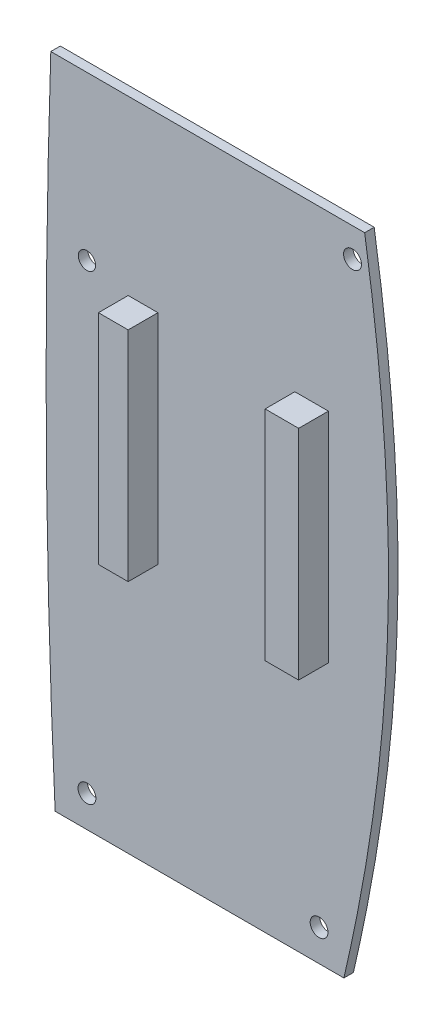
ISO-10303-21;
HEADER;
FILE_DESCRIPTION(('STEP AP214'),'2;1');
FILE_NAME('part.step','',(''),(''),'','','');
FILE_SCHEMA(('AUTOMOTIVE_DESIGN { 1 0 10303 214 1 1 1 1 }'));
ENDSEC;
DATA;
#1=APPLICATION_CONTEXT('core data for automotive mechanical design processes');
#2=APPLICATION_PROTOCOL_DEFINITION('international standard','automotive_design',2000,#1);
#3=PRODUCT_CONTEXT('',#1,'mechanical');
#4=PRODUCT('Part','Part','',(#3));
#5=PRODUCT_RELATED_PRODUCT_CATEGORY('part','',(#4));
#6=PRODUCT_DEFINITION_FORMATION('','',#4);
#7=PRODUCT_DEFINITION_CONTEXT('part definition',#1,'design');
#8=PRODUCT_DEFINITION('design','',#6,#7);
#9=PRODUCT_DEFINITION_SHAPE('','',#8);
#10=(LENGTH_UNIT() NAMED_UNIT(*) SI_UNIT(.MILLI.,.METRE.));
#11=(NAMED_UNIT(*) PLANE_ANGLE_UNIT() SI_UNIT($,.RADIAN.));
#12=(NAMED_UNIT(*) SI_UNIT($,.STERADIAN.) SOLID_ANGLE_UNIT());
#13=UNCERTAINTY_MEASURE_WITH_UNIT(LENGTH_MEASURE(1.E-05),#10,'distance_accuracy_value','');
#14=(GEOMETRIC_REPRESENTATION_CONTEXT(3) GLOBAL_UNCERTAINTY_ASSIGNED_CONTEXT((#13)) GLOBAL_UNIT_ASSIGNED_CONTEXT((#10,
#11,#12)) REPRESENTATION_CONTEXT('',''));
#15=CARTESIAN_POINT('',(0.,0.,0.));
#16=DIRECTION('',(0.,0.,1.));
#17=DIRECTION('',(1.,0.,0.));
#18=AXIS2_PLACEMENT_3D('',#15,#16,#17);
#19=CARTESIAN_POINT('',(7.89567877421469,5.17088600865722,57.));
#20=DIRECTION('',(0.,0.,1.));
#21=DIRECTION('',(1.,0.,0.));
#22=AXIS2_PLACEMENT_3D('',#19,#20,#21);
#23=PLANE('',#22);
#24=DIRECTION('',(0.,-1.,0.));
#25=VECTOR('',#24,1.);
#26=CARTESIAN_POINT('',(-7.72058582335578,31.4771190883367,56.9999999999954));
#27=LINE('',#26,#25);
#28=CARTESIAN_POINT('',(-7.72058582335578,31.4771190883367,56.9999999999954));
#29=VERTEX_POINT('',#28);
#30=CARTESIAN_POINT('',(-7.72058582335581,-5.15543731932285,56.9999999999954));
#31=VERTEX_POINT('',#30);
#32=EDGE_CURVE('E43',#29,#31,#27,.T.);
#33=ORIENTED_EDGE('',*,*,#32,.F.);
#34=DIRECTION('',(-1.,0.,0.));
#35=VECTOR('',#34,1.);
#36=CARTESIAN_POINT('',(-2.08219787617224,31.4771190883367,56.9999999999954));
#37=LINE('',#36,#35);
#38=CARTESIAN_POINT('',(-2.08219787617224,31.4771190883367,56.9999999999954));
#39=VERTEX_POINT('',#38);
#40=EDGE_CURVE('E171',#39,#29,#37,.T.);
#41=ORIENTED_EDGE('',*,*,#40,.F.);
#42=DIRECTION('',(0.,1.,0.));
#43=VECTOR('',#42,1.);
#44=CARTESIAN_POINT('',(-2.08219787617224,-5.15543731932285,56.9999999999954));
#45=LINE('',#44,#43);
#46=CARTESIAN_POINT('',(-2.08219787617224,-5.15543731932285,56.9999999999954));
#47=VERTEX_POINT('',#46);
#48=EDGE_CURVE('E167',#47,#39,#45,.T.);
#49=ORIENTED_EDGE('',*,*,#48,.F.);
#50=DIRECTION('',(1.,0.,0.));
#51=VECTOR('',#50,1.);
#52=CARTESIAN_POINT('',(-7.72058582335581,-5.15543731932285,56.9999999999954));
#53=LINE('',#52,#51);
#54=EDGE_CURVE('E163',#31,#47,#53,.T.);
#55=ORIENTED_EDGE('',*,*,#54,.F.);
#56=EDGE_LOOP('',(#33,#41,#49,#55));
#57=FACE_BOUND('',#56,.T.);
#58=CARTESIAN_POINT('',(4.00739224627871,60.477119088337,57.));
#59=CARTESIAN_POINT('',(5.43333073359915,51.3264832024376,57.));
#60=CARTESIAN_POINT('',(6.54900391871018,42.1415584414736,57.));
#61=CARTESIAN_POINT('',(7.40461832441734,30.600837603447,57.));
#62=CARTESIAN_POINT('',(7.54885707462838,28.2887196910434,57.));
#63=CARTESIAN_POINT('',(7.77976152528264,23.6651953164178,57.));
#64=CARTESIAN_POINT('',(7.86647537246692,21.3534255928287,57.));
#65=CARTESIAN_POINT('',(8.03658111829138,14.4180928113124,57.));
#66=CARTESIAN_POINT('',(8.0295827762736,9.79450604968723,57.));
#67=CARTESIAN_POINT('',(7.82872677318524,2.85907598814219,57.));
#68=CARTESIAN_POINT('',(7.73013289476406,0.547257669944885,57.));
#69=CARTESIAN_POINT('',(7.46913832012751,-4.07639569898101,57.));
#70=CARTESIAN_POINT('',(7.30678534194772,-6.38666143579652,57.));
#71=CARTESIAN_POINT('',(6.72643187845647,-13.299429900123,57.));
#72=CARTESIAN_POINT('',(6.21455108238158,-17.8891513423791,57.));
#73=CARTESIAN_POINT('',(4.95740874845812,-27.033504775496,57.));
#74=CARTESIAN_POINT('',(4.21227637536106,-31.5881561866408,57.));
#75=CARTESIAN_POINT('',(2.51364077693253,-40.66612986482,57.));
#76=CARTESIAN_POINT('',(1.56026994852288,-45.1894720381041,57.));
#77=CARTESIAN_POINT('',(0.517305485340313,-49.6993435562314,57.));
#78=B_SPLINE_CURVE_WITH_KNOTS('',3,(#58,#59,#60,#61,#62,#63,#64,#65,#66,#67,#68,#69,#70,#71,#72,
#73,#74,#75,#76,#77),.UNSPECIFIED.,.F.,.F.,(4,2,2,2,2,2,2,2,2,4),(0.,0.25,0.3125,0.375,0.5,
0.5625,0.625,0.75,0.875,1.),.UNSPECIFIED.);
#79=CARTESIAN_POINT('',(4.00739224627871,60.477119088337,57.));
#80=VERTEX_POINT('',#79);
#81=CARTESIAN_POINT('',(0.517305485340313,-49.6993435562314,57.));
#82=VERTEX_POINT('',#81);
#83=EDGE_CURVE('E205',#80,#82,#78,.T.);
#84=ORIENTED_EDGE('',*,*,#83,.F.);
#85=DIRECTION('',(1.,0.,0.));
#86=VECTOR('',#85,1.);
#87=CARTESIAN_POINT('',(-48.7225396291997,60.4771190883368,57.));
#88=LINE('',#87,#86);
#89=CARTESIAN_POINT('',(-48.7225396291997,60.4771190883368,57.));
#90=VERTEX_POINT('',#89);
#91=EDGE_CURVE('E227',#90,#80,#88,.T.);
#92=ORIENTED_EDGE('',*,*,#91,.F.);
#93=CARTESIAN_POINT('',(-47.992876177723,-49.6993435562314,57.));
#94=CARTESIAN_POINT('',(-48.4312043906747,-40.5250224919465,57.));
#95=CARTESIAN_POINT('',(-48.7792687225727,-31.3473730506425,57.));
#96=CARTESIAN_POINT('',(-49.2798548054885,-12.9848637597862,57.));
#97=CARTESIAN_POINT('',(-49.4321794219055,-3.80159394272926,57.));
#98=CARTESIAN_POINT('',(-49.5415642027007,14.567135328284,57.));
#99=CARTESIAN_POINT('',(-49.4986713370206,23.7515176759512,57.));
#100=CARTESIAN_POINT('',(-49.2356415747046,42.1162375276829,57.));
#101=CARTESIAN_POINT('',(-49.0157447637978,51.2972409029398,57.));
#102=CARTESIAN_POINT('',(-48.7225396291997,60.4771190883368,57.));
#103=B_SPLINE_CURVE_WITH_KNOTS('',3,(#93,#94,#95,#96,#97,#98,#99,#100,#101,#102),.UNSPECIFIED.,
.F.,.F.,(4,2,2,2,4),(0.,0.25,0.5,0.75,1.),.UNSPECIFIED.);
#104=CARTESIAN_POINT('',(-47.992876177723,-49.6993435562314,57.));
#105=VERTEX_POINT('',#104);
#106=EDGE_CURVE('E220',#105,#90,#103,.T.);
#107=ORIENTED_EDGE('',*,*,#106,.F.);
#108=DIRECTION('',(-1.,0.,0.));
#109=VECTOR('',#108,1.);
#110=CARTESIAN_POINT('',(0.517305485340316,-49.6993435562314,57.));
#111=LINE('',#110,#109);
#112=EDGE_CURVE('E212',#82,#105,#111,.T.);
#113=ORIENTED_EDGE('',*,*,#112,.F.);
#114=EDGE_LOOP('',(#84,#92,#107,#113));
#115=FACE_BOUND('',#114,.T.);
#116=CARTESIAN_POINT('',(-3.65,-44.4,57.));
#117=DIRECTION('',(0.,0.,1.));
#118=DIRECTION('',(1.,0.,0.));
#119=AXIS2_PLACEMENT_3D('',#116,#117,#118);
#120=CIRCLE('',#119,1.5);
#121=CARTESIAN_POINT('',(-2.15,-44.4,57.));
#122=VERTEX_POINT('',#121);
#123=EDGE_CURVE('E282',#122,#122,#120,.T.);
#124=ORIENTED_EDGE('',*,*,#123,.F.);
#125=EDGE_LOOP('',(#124));
#126=FACE_BOUND('',#125,.T.);
#127=CARTESIAN_POINT('',(-42.65,33.1,57.));
#128=DIRECTION('',(0.,0.,1.));
#129=DIRECTION('',(1.,0.,0.));
#130=AXIS2_PLACEMENT_3D('',#127,#128,#129);
#131=CIRCLE('',#130,1.45);
#132=CARTESIAN_POINT('',(-41.2,33.1,57.));
#133=VERTEX_POINT('',#132);
#134=EDGE_CURVE('E352',#133,#133,#131,.T.);
#135=ORIENTED_EDGE('',*,*,#134,.F.);
#136=EDGE_LOOP('',(#135));
#137=FACE_BOUND('',#136,.T.);
#138=CARTESIAN_POINT('',(-42.65,-44.4,57.));
#139=DIRECTION('',(0.,0.,1.));
#140=DIRECTION('',(1.,0.,0.));
#141=AXIS2_PLACEMENT_3D('',#138,#139,#140);
#142=CIRCLE('',#141,1.5);
#143=CARTESIAN_POINT('',(-41.15,-44.4,57.));
#144=VERTEX_POINT('',#143);
#145=EDGE_CURVE('E347',#144,#144,#142,.T.);
#146=ORIENTED_EDGE('',*,*,#145,.F.);
#147=EDGE_LOOP('',(#146));
#148=FACE_BOUND('',#147,.T.);
#149=CARTESIAN_POINT('',(1.96647973955895,55.5985700428982,57.));
#150=DIRECTION('',(0.,0.,1.));
#151=DIRECTION('',(1.,0.,0.));
#152=AXIS2_PLACEMENT_3D('',#149,#150,#151);
#153=CIRCLE('',#152,1.5);
#154=CARTESIAN_POINT('',(3.46647973955895,55.5985700428982,57.));
#155=VERTEX_POINT('',#154);
#156=EDGE_CURVE('E351',#155,#155,#153,.T.);
#157=ORIENTED_EDGE('',*,*,#156,.F.);
#158=EDGE_LOOP('',(#157));
#159=FACE_BOUND('',#158,.T.);
#160=DIRECTION('',(0.,1.,0.));
#161=VECTOR('',#160,1.);
#162=CARTESIAN_POINT('',(-30.7225396291998,-5.15543731932285,56.9999999999954));
#163=LINE('',#162,#161);
#164=CARTESIAN_POINT('',(-30.7225396291998,-5.15543731932285,56.9999999999954));
#165=VERTEX_POINT('',#164);
#166=CARTESIAN_POINT('',(-30.7225396291998,31.4771190883367,56.9999999999969));
#167=VERTEX_POINT('',#166);
#168=EDGE_CURVE('E35',#165,#167,#163,.T.);
#169=ORIENTED_EDGE('',*,*,#168,.F.);
#170=DIRECTION('',(1.,0.,0.));
#171=VECTOR('',#170,1.);
#172=CARTESIAN_POINT('',(-35.7225396291997,-5.15543731932285,56.9999999999954));
#173=LINE('',#172,#171);
#174=CARTESIAN_POINT('',(-35.7225396291997,-5.15543731932285,56.9999999999954));
#175=VERTEX_POINT('',#174);
#176=EDGE_CURVE('E130',#175,#165,#173,.T.);
#177=ORIENTED_EDGE('',*,*,#176,.F.);
#178=DIRECTION('',(0.,-1.,0.));
#179=VECTOR('',#178,1.);
#180=CARTESIAN_POINT('',(-35.7225396291997,31.4771190883367,56.9999999999954));
#181=LINE('',#180,#179);
#182=CARTESIAN_POINT('',(-35.7225396291997,31.4771190883367,56.9999999999954));
#183=VERTEX_POINT('',#182);
#184=EDGE_CURVE('E115',#183,#175,#181,.T.);
#185=ORIENTED_EDGE('',*,*,#184,.F.);
#186=DIRECTION('',(-1.,0.,0.));
#187=VECTOR('',#186,1.);
#188=CARTESIAN_POINT('',(-30.7225396291998,31.4771190883367,56.9999999999954));
#189=LINE('',#188,#187);
#190=EDGE_CURVE('E122',#167,#183,#189,.T.);
#191=ORIENTED_EDGE('',*,*,#190,.F.);
#192=EDGE_LOOP('',(#169,#177,#185,#191));
#193=FACE_BOUND('',#192,.T.);
#194=ADVANCED_FACE('F17',(#57,#115,#126,#137,#148,#159,#193),#23,.T.);
#195=DIRECTION('',(0.,0.,-1.));
#196=VECTOR('',#195,1.);
#197=SURFACE_OF_LINEAR_EXTRUSION('',#78,#196);
#198=CARTESIAN_POINT('',(4.00739224627871,60.477119088337,55.4));
#199=CARTESIAN_POINT('',(5.43333073359915,51.3264832024376,55.4));
#200=CARTESIAN_POINT('',(6.54900391871018,42.1415584414736,55.4));
#201=CARTESIAN_POINT('',(7.40461832441734,30.600837603447,55.4));
#202=CARTESIAN_POINT('',(7.54885707462838,28.2887196910434,55.4));
#203=CARTESIAN_POINT('',(7.77976152528264,23.6651953164178,55.4));
#204=CARTESIAN_POINT('',(7.86647537246692,21.3534255928287,55.4));
#205=CARTESIAN_POINT('',(8.03658111829138,14.4180928113124,55.4));
#206=CARTESIAN_POINT('',(8.0295827762736,9.79450604968723,55.4));
#207=CARTESIAN_POINT('',(7.82872677318524,2.85907598814219,55.4));
#208=CARTESIAN_POINT('',(7.73013289476406,0.547257669944885,55.4));
#209=CARTESIAN_POINT('',(7.46913832012751,-4.07639569898101,55.4));
#210=CARTESIAN_POINT('',(7.30678534194772,-6.38666143579652,55.4));
#211=CARTESIAN_POINT('',(6.72643187845647,-13.299429900123,55.4));
#212=CARTESIAN_POINT('',(6.21455108238158,-17.8891513423791,55.4));
#213=CARTESIAN_POINT('',(4.95740874845812,-27.033504775496,55.4));
#214=CARTESIAN_POINT('',(4.21227637536106,-31.5881561866408,55.4));
#215=CARTESIAN_POINT('',(2.51364077693253,-40.66612986482,55.4));
#216=CARTESIAN_POINT('',(1.56026994852288,-45.1894720381041,55.4));
#217=CARTESIAN_POINT('',(0.517305485340313,-49.6993435562314,55.4));
#218=B_SPLINE_CURVE_WITH_KNOTS('',3,(#198,#199,#200,#201,#202,#203,#204,#205,#206,#207,#208,
#209,#210,#211,#212,#213,#214,#215,#216,#217),.UNSPECIFIED.,.F.,.F.,(4,2,2,2,2,2,2,2,2,4),(0.,
0.25,0.3125,0.375,0.5,0.5625,0.625,0.75,0.875,1.),.UNSPECIFIED.);
#219=CARTESIAN_POINT('',(4.00739224627871,60.477119088337,55.4));
#220=VERTEX_POINT('',#219);
#221=CARTESIAN_POINT('',(0.517305485340313,-49.6993435562314,55.4));
#222=VERTEX_POINT('',#221);
#223=EDGE_CURVE('E194',#220,#222,#218,.T.);
#224=ORIENTED_EDGE('',*,*,#223,.F.);
#225=DIRECTION('',(0.,0.,-1.));
#226=VECTOR('',#225,1.);
#227=CARTESIAN_POINT('',(4.00739224627871,60.477119088337,57.));
#228=LINE('',#227,#226);
#229=EDGE_CURVE('E22',#80,#220,#228,.T.);
#230=ORIENTED_EDGE('',*,*,#229,.F.);
#231=ORIENTED_EDGE('',*,*,#83,.T.);
#232=DIRECTION('',(0.,0.,-1.));
#233=VECTOR('',#232,1.);
#234=CARTESIAN_POINT('',(0.517305485340313,-49.6993435562314,57.));
#235=LINE('',#234,#233);
#236=EDGE_CURVE('E11',#82,#222,#235,.T.);
#237=ORIENTED_EDGE('',*,*,#236,.T.);
#238=EDGE_LOOP('',(#224,#230,#231,#237));
#239=FACE_BOUND('',#238,.T.);
#240=ADVANCED_FACE('F19',(#239),#197,.T.);
#241=CARTESIAN_POINT('',(0.517305485340316,-49.6993435562314,57.));
#242=DIRECTION('',(0.,-1.,0.));
#243=DIRECTION('',(0.,0.,-1.));
#244=AXIS2_PLACEMENT_3D('',#241,#242,#243);
#245=PLANE('',#244);
#246=DIRECTION('',(-1.,0.,0.));
#247=VECTOR('',#246,1.);
#248=CARTESIAN_POINT('',(0.517305485340316,-49.6993435562314,55.4));
#249=LINE('',#248,#247);
#250=CARTESIAN_POINT('',(-47.992876177723,-49.6993435562314,55.4));
#251=VERTEX_POINT('',#250);
#252=EDGE_CURVE('E312',#222,#251,#249,.T.);
#253=ORIENTED_EDGE('',*,*,#252,.F.);
#254=ORIENTED_EDGE('',*,*,#236,.F.);
#255=ORIENTED_EDGE('',*,*,#112,.T.);
#256=DIRECTION('',(0.,0.,-1.));
#257=VECTOR('',#256,1.);
#258=CARTESIAN_POINT('',(-47.992876177723,-49.6993435562314,57.));
#259=LINE('',#258,#257);
#260=EDGE_CURVE('E28',#105,#251,#259,.T.);
#261=ORIENTED_EDGE('',*,*,#260,.T.);
#262=EDGE_LOOP('',(#253,#254,#255,#261));
#263=FACE_BOUND('',#262,.T.);
#264=ADVANCED_FACE('F237',(#263),#245,.T.);
#265=DIRECTION('',(0.,0.,-1.));
#266=VECTOR('',#265,1.);
#267=SURFACE_OF_LINEAR_EXTRUSION('',#103,#266);
#268=CARTESIAN_POINT('',(-47.992876177723,-49.6993435562314,55.4));
#269=CARTESIAN_POINT('',(-48.4312043906747,-40.5250224919465,55.4));
#270=CARTESIAN_POINT('',(-48.7792687225727,-31.3473730506425,55.4));
#271=CARTESIAN_POINT('',(-49.2798548054885,-12.9848637597862,55.4));
#272=CARTESIAN_POINT('',(-49.4321794219055,-3.80159394272926,55.4));
#273=CARTESIAN_POINT('',(-49.5415642027007,14.567135328284,55.4));
#274=CARTESIAN_POINT('',(-49.4986713370206,23.7515176759512,55.4));
#275=CARTESIAN_POINT('',(-49.2356415747046,42.1162375276829,55.4));
#276=CARTESIAN_POINT('',(-49.0157447637978,51.2972409029398,55.4));
#277=CARTESIAN_POINT('',(-48.7225396291997,60.4771190883368,55.4));
#278=B_SPLINE_CURVE_WITH_KNOTS('',3,(#268,#269,#270,#271,#272,#273,#274,#275,#276,#277),
.UNSPECIFIED.,.F.,.F.,(4,2,2,2,4),(0.,0.25,0.5,0.75,1.),.UNSPECIFIED.);
#279=CARTESIAN_POINT('',(-48.7225396291997,60.4771190883368,55.4));
#280=VERTEX_POINT('',#279);
#281=EDGE_CURVE('E300',#251,#280,#278,.T.);
#282=ORIENTED_EDGE('',*,*,#281,.F.);
#283=ORIENTED_EDGE('',*,*,#260,.F.);
#284=ORIENTED_EDGE('',*,*,#106,.T.);
#285=DIRECTION('',(0.,0.,-1.));
#286=VECTOR('',#285,1.);
#287=CARTESIAN_POINT('',(-48.7225396291997,60.4771190883368,57.));
#288=LINE('',#287,#286);
#289=EDGE_CURVE('E304',#90,#280,#288,.T.);
#290=ORIENTED_EDGE('',*,*,#289,.T.);
#291=EDGE_LOOP('',(#282,#283,#284,#290));
#292=FACE_BOUND('',#291,.T.);
#293=ADVANCED_FACE('F233',(#292),#267,.T.);
#294=CARTESIAN_POINT('',(-42.65,-44.4,57.));
#295=DIRECTION('',(0.,0.,-1.));
#296=DIRECTION('',(-1.,0.,0.));
#297=AXIS2_PLACEMENT_3D('',#294,#295,#296);
#298=CYLINDRICAL_SURFACE('',#297,1.5);
#299=ORIENTED_EDGE('',*,*,#145,.T.);
#300=EDGE_LOOP('',(#299));
#301=FACE_BOUND('',#300,.T.);
#302=CARTESIAN_POINT('',(-42.65,-44.4,55.4));
#303=DIRECTION('',(0.,0.,1.));
#304=DIRECTION('',(1.,0.,0.));
#305=AXIS2_PLACEMENT_3D('',#302,#303,#304);
#306=CIRCLE('',#305,1.5);
#307=CARTESIAN_POINT('',(-41.15,-44.4,55.4));
#308=VERTEX_POINT('',#307);
#309=EDGE_CURVE('E296',#308,#308,#306,.T.);
#310=ORIENTED_EDGE('',*,*,#309,.F.);
#311=EDGE_LOOP('',(#310));
#312=FACE_BOUND('',#311,.T.);
#313=ADVANCED_FACE('F236',(#301,#312),#298,.F.);
#314=CARTESIAN_POINT('',(-42.65,33.1,57.));
#315=DIRECTION('',(0.,0.,-1.));
#316=DIRECTION('',(-1.,0.,0.));
#317=AXIS2_PLACEMENT_3D('',#314,#315,#316);
#318=CYLINDRICAL_SURFACE('',#317,1.45);
#319=ORIENTED_EDGE('',*,*,#134,.T.);
#320=EDGE_LOOP('',(#319));
#321=FACE_BOUND('',#320,.T.);
#322=CARTESIAN_POINT('',(-42.65,33.1,55.4));
#323=DIRECTION('',(0.,0.,1.));
#324=DIRECTION('',(1.,0.,0.));
#325=AXIS2_PLACEMENT_3D('',#322,#323,#324);
#326=CIRCLE('',#325,1.45);
#327=CARTESIAN_POINT('',(-41.2,33.1,55.4));
#328=VERTEX_POINT('',#327);
#329=EDGE_CURVE('E288',#328,#328,#326,.T.);
#330=ORIENTED_EDGE('',*,*,#329,.F.);
#331=EDGE_LOOP('',(#330));
#332=FACE_BOUND('',#331,.T.);
#333=ADVANCED_FACE('F268',(#321,#332),#318,.F.);
#334=CARTESIAN_POINT('',(-3.65,-44.4,57.));
#335=DIRECTION('',(0.,0.,-1.));
#336=DIRECTION('',(-1.,0.,0.));
#337=AXIS2_PLACEMENT_3D('',#334,#335,#336);
#338=CYLINDRICAL_SURFACE('',#337,1.5);
#339=ORIENTED_EDGE('',*,*,#123,.T.);
#340=EDGE_LOOP('',(#339));
#341=FACE_BOUND('',#340,.T.);
#342=CARTESIAN_POINT('',(-3.65,-44.4,55.4));
#343=DIRECTION('',(0.,0.,1.));
#344=DIRECTION('',(1.,0.,0.));
#345=AXIS2_PLACEMENT_3D('',#342,#343,#344);
#346=CIRCLE('',#345,1.5);
#347=CARTESIAN_POINT('',(-2.15,-44.4,55.4));
#348=VERTEX_POINT('',#347);
#349=EDGE_CURVE('E285',#348,#348,#346,.T.);
#350=ORIENTED_EDGE('',*,*,#349,.F.);
#351=EDGE_LOOP('',(#350));
#352=FACE_BOUND('',#351,.T.);
#353=ADVANCED_FACE('F271',(#341,#352),#338,.F.);
#354=CARTESIAN_POINT('',(-48.7225396291997,60.4771190883368,57.));
#355=DIRECTION('',(0.,1.,0.));
#356=DIRECTION('',(-1.,0.,0.));
#357=AXIS2_PLACEMENT_3D('',#354,#355,#356);
#358=PLANE('',#357);
#359=DIRECTION('',(1.,0.,0.));
#360=VECTOR('',#359,1.);
#361=CARTESIAN_POINT('',(-48.7225396291997,60.4771190883368,55.4));
#362=LINE('',#361,#360);
#363=EDGE_CURVE('E289',#280,#220,#362,.T.);
#364=ORIENTED_EDGE('',*,*,#363,.F.);
#365=ORIENTED_EDGE('',*,*,#289,.F.);
#366=ORIENTED_EDGE('',*,*,#91,.T.);
#367=ORIENTED_EDGE('',*,*,#229,.T.);
#368=EDGE_LOOP('',(#364,#365,#366,#367));
#369=FACE_BOUND('',#368,.T.);
#370=ADVANCED_FACE('F239',(#369),#358,.T.);
#371=CARTESIAN_POINT('',(1.96647973955895,55.5985700428982,57.));
#372=DIRECTION('',(0.,0.,-1.));
#373=DIRECTION('',(-1.,0.,0.));
#374=AXIS2_PLACEMENT_3D('',#371,#372,#373);
#375=CYLINDRICAL_SURFACE('',#374,1.5);
#376=ORIENTED_EDGE('',*,*,#156,.T.);
#377=EDGE_LOOP('',(#376));
#378=FACE_BOUND('',#377,.T.);
#379=CARTESIAN_POINT('',(1.96647973955895,55.5985700428982,55.4));
#380=DIRECTION('',(0.,0.,1.));
#381=DIRECTION('',(1.,0.,0.));
#382=AXIS2_PLACEMENT_3D('',#379,#380,#381);
#383=CIRCLE('',#382,1.5);
#384=CARTESIAN_POINT('',(3.46647973955895,55.5985700428982,55.4));
#385=VERTEX_POINT('',#384);
#386=EDGE_CURVE('E213',#385,#385,#383,.T.);
#387=ORIENTED_EDGE('',*,*,#386,.F.);
#388=EDGE_LOOP('',(#387));
#389=FACE_BOUND('',#388,.T.);
#390=ADVANCED_FACE('F261',(#378,#389),#375,.F.);
#391=CARTESIAN_POINT('',(7.89567877421469,5.17088600865722,55.4));
#392=DIRECTION('',(0.,0.,1.));
#393=DIRECTION('',(1.,0.,0.));
#394=AXIS2_PLACEMENT_3D('',#391,#392,#393);
#395=PLANE('',#394);
#396=ORIENTED_EDGE('',*,*,#223,.T.);
#397=ORIENTED_EDGE('',*,*,#252,.T.);
#398=ORIENTED_EDGE('',*,*,#281,.T.);
#399=ORIENTED_EDGE('',*,*,#363,.T.);
#400=EDGE_LOOP('',(#396,#397,#398,#399));
#401=FACE_BOUND('',#400,.T.);
#402=ORIENTED_EDGE('',*,*,#349,.T.);
#403=EDGE_LOOP('',(#402));
#404=FACE_BOUND('',#403,.T.);
#405=ORIENTED_EDGE('',*,*,#329,.T.);
#406=EDGE_LOOP('',(#405));
#407=FACE_BOUND('',#406,.T.);
#408=ORIENTED_EDGE('',*,*,#309,.T.);
#409=EDGE_LOOP('',(#408));
#410=FACE_BOUND('',#409,.T.);
#411=ORIENTED_EDGE('',*,*,#386,.T.);
#412=EDGE_LOOP('',(#411));
#413=FACE_BOUND('',#412,.T.);
#414=ADVANCED_FACE('F258',(#401,#404,#407,#410,#413),#395,.F.);
#415=CARTESIAN_POINT('',(0.,0.,62.));
#416=DIRECTION('',(0.,0.,1.));
#417=DIRECTION('',(1.,0.,0.));
#418=AXIS2_PLACEMENT_3D('',#415,#416,#417);
#419=PLANE('',#418);
#420=DIRECTION('',(0.,-1.,0.));
#421=VECTOR('',#420,1.);
#422=CARTESIAN_POINT('',(-7.72058582335578,31.4771190883367,62.));
#423=LINE('',#422,#421);
#424=CARTESIAN_POINT('',(-7.72058582335578,31.4771190883367,62.));
#425=VERTEX_POINT('',#424);
#426=CARTESIAN_POINT('',(-7.72058582335581,-5.15543731932285,62.));
#427=VERTEX_POINT('',#426);
#428=EDGE_CURVE('E188',#425,#427,#423,.T.);
#429=ORIENTED_EDGE('',*,*,#428,.T.);
#430=DIRECTION('',(1.,0.,0.));
#431=VECTOR('',#430,1.);
#432=CARTESIAN_POINT('',(-7.72058582335581,-5.15543731932285,62.));
#433=LINE('',#432,#431);
#434=CARTESIAN_POINT('',(-2.08219787617224,-5.15543731932285,62.));
#435=VERTEX_POINT('',#434);
#436=EDGE_CURVE('E199',#427,#435,#433,.T.);
#437=ORIENTED_EDGE('',*,*,#436,.T.);
#438=DIRECTION('',(0.,1.,0.));
#439=VECTOR('',#438,1.);
#440=CARTESIAN_POINT('',(-2.08219787617224,-5.15543731932285,62.));
#441=LINE('',#440,#439);
#442=CARTESIAN_POINT('',(-2.08219787617224,31.4771190883367,62.));
#443=VERTEX_POINT('',#442);
#444=EDGE_CURVE('E195',#435,#443,#441,.T.);
#445=ORIENTED_EDGE('',*,*,#444,.T.);
#446=DIRECTION('',(-1.,0.,0.));
#447=VECTOR('',#446,1.);
#448=CARTESIAN_POINT('',(-2.08219787617224,31.4771190883367,62.));
#449=LINE('',#448,#447);
#450=EDGE_CURVE('E191',#443,#425,#449,.T.);
#451=ORIENTED_EDGE('',*,*,#450,.T.);
#452=EDGE_LOOP('',(#429,#437,#445,#451));
#453=FACE_BOUND('',#452,.T.);
#454=ADVANCED_FACE('F256',(#453),#419,.T.);
#455=CARTESIAN_POINT('',(-7.72058582335581,-5.15543731932285,65.8));
#456=DIRECTION('',(0.,1.,0.));
#457=DIRECTION('',(0.,0.,1.));
#458=AXIS2_PLACEMENT_3D('',#455,#456,#457);
#459=PLANE('',#458);
#460=ORIENTED_EDGE('',*,*,#436,.F.);
#461=DIRECTION('',(0.,0.,-1.));
#462=VECTOR('',#461,1.);
#463=CARTESIAN_POINT('',(-7.72058582335581,-5.15543731932285,65.8));
#464=LINE('',#463,#462);
#465=EDGE_CURVE('E184',#427,#31,#464,.T.);
#466=ORIENTED_EDGE('',*,*,#465,.T.);
#467=ORIENTED_EDGE('',*,*,#54,.T.);
#468=DIRECTION('',(0.,0.,-1.));
#469=VECTOR('',#468,1.);
#470=CARTESIAN_POINT('',(-2.08219787617224,-5.15543731932285,65.8));
#471=LINE('',#470,#469);
#472=EDGE_CURVE('E180',#435,#47,#471,.T.);
#473=ORIENTED_EDGE('',*,*,#472,.F.);
#474=EDGE_LOOP('',(#460,#466,#467,#473));
#475=FACE_BOUND('',#474,.T.);
#476=ADVANCED_FACE('F454',(#475),#459,.F.);
#477=CARTESIAN_POINT('',(-7.72058582335578,31.4771190883367,65.8));
#478=DIRECTION('',(1.,0.,0.));
#479=DIRECTION('',(0.,1.,0.));
#480=AXIS2_PLACEMENT_3D('',#477,#478,#479);
#481=PLANE('',#480);
#482=ORIENTED_EDGE('',*,*,#428,.F.);
#483=DIRECTION('',(0.,0.,-1.));
#484=VECTOR('',#483,1.);
#485=CARTESIAN_POINT('',(-7.72058582335578,31.4771190883367,65.8));
#486=LINE('',#485,#484);
#487=EDGE_CURVE('E175',#425,#29,#486,.T.);
#488=ORIENTED_EDGE('',*,*,#487,.T.);
#489=ORIENTED_EDGE('',*,*,#32,.T.);
#490=ORIENTED_EDGE('',*,*,#465,.F.);
#491=EDGE_LOOP('',(#482,#488,#489,#490));
#492=FACE_BOUND('',#491,.T.);
#493=ADVANCED_FACE('F465',(#492),#481,.F.);
#494=CARTESIAN_POINT('',(-2.08219787617224,-5.15543731932285,65.8));
#495=DIRECTION('',(-1.,0.,0.));
#496=DIRECTION('',(0.,0.,1.));
#497=AXIS2_PLACEMENT_3D('',#494,#495,#496);
#498=PLANE('',#497);
#499=ORIENTED_EDGE('',*,*,#444,.F.);
#500=ORIENTED_EDGE('',*,*,#472,.T.);
#501=ORIENTED_EDGE('',*,*,#48,.T.);
#502=DIRECTION('',(0.,0.,-1.));
#503=VECTOR('',#502,1.);
#504=CARTESIAN_POINT('',(-2.08219787617224,31.4771190883367,65.8));
#505=LINE('',#504,#503);
#506=EDGE_CURVE('E176',#443,#39,#505,.T.);
#507=ORIENTED_EDGE('',*,*,#506,.F.);
#508=EDGE_LOOP('',(#499,#500,#501,#507));
#509=FACE_BOUND('',#508,.T.);
#510=ADVANCED_FACE('F477',(#509),#498,.F.);
#511=CARTESIAN_POINT('',(-2.08219787617224,31.4771190883367,65.8));
#512=DIRECTION('',(0.,-1.,0.));
#513=DIRECTION('',(0.,0.,-1.));
#514=AXIS2_PLACEMENT_3D('',#511,#512,#513);
#515=PLANE('',#514);
#516=ORIENTED_EDGE('',*,*,#450,.F.);
#517=ORIENTED_EDGE('',*,*,#506,.T.);
#518=ORIENTED_EDGE('',*,*,#40,.T.);
#519=ORIENTED_EDGE('',*,*,#487,.F.);
#520=EDGE_LOOP('',(#516,#517,#518,#519));
#521=FACE_BOUND('',#520,.T.);
#522=ADVANCED_FACE('F456',(#521),#515,.F.);
#523=CARTESIAN_POINT('',(0.,0.,62.));
#524=DIRECTION('',(0.,0.,1.));
#525=DIRECTION('',(1.,0.,0.));
#526=AXIS2_PLACEMENT_3D('',#523,#524,#525);
#527=PLANE('',#526);
#528=DIRECTION('',(0.,-1.,0.));
#529=VECTOR('',#528,1.);
#530=CARTESIAN_POINT('',(-35.7225396291997,31.4771190883367,62.));
#531=LINE('',#530,#529);
#532=CARTESIAN_POINT('',(-35.7225396291997,31.4771190883367,62.));
#533=VERTEX_POINT('',#532);
#534=CARTESIAN_POINT('',(-35.7225396291997,-5.15543731932285,62.));
#535=VERTEX_POINT('',#534);
#536=EDGE_CURVE('E118',#533,#535,#531,.T.);
#537=ORIENTED_EDGE('',*,*,#536,.T.);
#538=DIRECTION('',(1.,0.,0.));
#539=VECTOR('',#538,1.);
#540=CARTESIAN_POINT('',(-35.7225396291997,-5.15543731932285,62.));
#541=LINE('',#540,#539);
#542=CARTESIAN_POINT('',(-30.7225396291998,-5.15543731932285,62.));
#543=VERTEX_POINT('',#542);
#544=EDGE_CURVE('E156',#535,#543,#541,.T.);
#545=ORIENTED_EDGE('',*,*,#544,.T.);
#546=DIRECTION('',(0.,1.,0.));
#547=VECTOR('',#546,1.);
#548=CARTESIAN_POINT('',(-30.7225396291998,-5.15543731932285,62.));
#549=LINE('',#548,#547);
#550=CARTESIAN_POINT('',(-30.7225396291998,31.4771190883367,62.));
#551=VERTEX_POINT('',#550);
#552=EDGE_CURVE('E152',#543,#551,#549,.T.);
#553=ORIENTED_EDGE('',*,*,#552,.T.);
#554=DIRECTION('',(-1.,0.,0.));
#555=VECTOR('',#554,1.);
#556=CARTESIAN_POINT('',(-30.7225396291998,31.4771190883367,62.));
#557=LINE('',#556,#555);
#558=EDGE_CURVE('E149',#551,#533,#557,.T.);
#559=ORIENTED_EDGE('',*,*,#558,.T.);
#560=EDGE_LOOP('',(#537,#545,#553,#559));
#561=FACE_BOUND('',#560,.T.);
#562=ADVANCED_FACE('F468',(#561),#527,.T.);
#563=CARTESIAN_POINT('',(-35.7225396291997,-5.15543731932285,65.8));
#564=DIRECTION('',(0.,1.,0.));
#565=DIRECTION('',(0.,0.,1.));
#566=AXIS2_PLACEMENT_3D('',#563,#564,#565);
#567=PLANE('',#566);
#568=ORIENTED_EDGE('',*,*,#544,.F.);
#569=DIRECTION('',(0.,0.,-1.));
#570=VECTOR('',#569,1.);
#571=CARTESIAN_POINT('',(-35.7225396291997,-5.15543731932285,65.8));
#572=LINE('',#571,#570);
#573=EDGE_CURVE('E146',#535,#175,#572,.T.);
#574=ORIENTED_EDGE('',*,*,#573,.T.);
#575=ORIENTED_EDGE('',*,*,#176,.T.);
#576=DIRECTION('',(0.,0.,-1.));
#577=VECTOR('',#576,1.);
#578=CARTESIAN_POINT('',(-30.7225396291998,-5.15543731932285,65.8));
#579=LINE('',#578,#577);
#580=EDGE_CURVE('E143',#543,#165,#579,.T.);
#581=ORIENTED_EDGE('',*,*,#580,.F.);
#582=EDGE_LOOP('',(#568,#574,#575,#581));
#583=FACE_BOUND('',#582,.T.);
#584=ADVANCED_FACE('F507',(#583),#567,.F.);
#585=CARTESIAN_POINT('',(-35.7225396291997,31.4771190883367,65.8));
#586=DIRECTION('',(1.,0.,0.));
#587=DIRECTION('',(0.,1.,0.));
#588=AXIS2_PLACEMENT_3D('',#585,#586,#587);
#589=PLANE('',#588);
#590=ORIENTED_EDGE('',*,*,#536,.F.);
#591=DIRECTION('',(0.,0.,-1.));
#592=VECTOR('',#591,1.);
#593=CARTESIAN_POINT('',(-35.7225396291997,31.4771190883367,65.8));
#594=LINE('',#593,#592);
#595=EDGE_CURVE('E110',#533,#183,#594,.T.);
#596=ORIENTED_EDGE('',*,*,#595,.T.);
#597=ORIENTED_EDGE('',*,*,#184,.T.);
#598=ORIENTED_EDGE('',*,*,#573,.F.);
#599=EDGE_LOOP('',(#590,#596,#597,#598));
#600=FACE_BOUND('',#599,.T.);
#601=ADVANCED_FACE('F112',(#600),#589,.F.);
#602=CARTESIAN_POINT('',(-30.7225396291998,-5.15543731932285,65.8));
#603=DIRECTION('',(-1.,0.,0.));
#604=DIRECTION('',(0.,-1.,0.));
#605=AXIS2_PLACEMENT_3D('',#602,#603,#604);
#606=PLANE('',#605);
#607=ORIENTED_EDGE('',*,*,#552,.F.);
#608=ORIENTED_EDGE('',*,*,#580,.T.);
#609=ORIENTED_EDGE('',*,*,#168,.T.);
#610=DIRECTION('',(0.,0.,-1.));
#611=VECTOR('',#610,1.);
#612=CARTESIAN_POINT('',(-30.7225396291998,31.4771190883367,65.8));
#613=LINE('',#612,#611);
#614=EDGE_CURVE('E121',#551,#167,#613,.T.);
#615=ORIENTED_EDGE('',*,*,#614,.F.);
#616=EDGE_LOOP('',(#607,#608,#609,#615));
#617=FACE_BOUND('',#616,.T.);
#618=ADVANCED_FACE('F528',(#617),#606,.F.);
#619=CARTESIAN_POINT('',(-30.7225396291998,31.4771190883367,65.8));
#620=DIRECTION('',(0.,-1.,0.));
#621=DIRECTION('',(1.,0.,0.));
#622=AXIS2_PLACEMENT_3D('',#619,#620,#621);
#623=PLANE('',#622);
#624=ORIENTED_EDGE('',*,*,#558,.F.);
#625=ORIENTED_EDGE('',*,*,#614,.T.);
#626=ORIENTED_EDGE('',*,*,#190,.T.);
#627=ORIENTED_EDGE('',*,*,#595,.F.);
#628=EDGE_LOOP('',(#624,#625,#626,#627));
#629=FACE_BOUND('',#628,.T.);
#630=ADVANCED_FACE('F125',(#629),#623,.F.);
#631=CLOSED_SHELL('',(#194,#240,#264,#293,#313,#333,#353,#370,#390,#414,#454,#476,#493,#510,
#522,#562,#584,#601,#618,#630));
#632=MANIFOLD_SOLID_BREP('B1',#631);
#633=ADVANCED_BREP_SHAPE_REPRESENTATION('',(#18,#632),#14);
#634=SHAPE_DEFINITION_REPRESENTATION(#9,#633);
ENDSEC;
END-ISO-10303-21;
